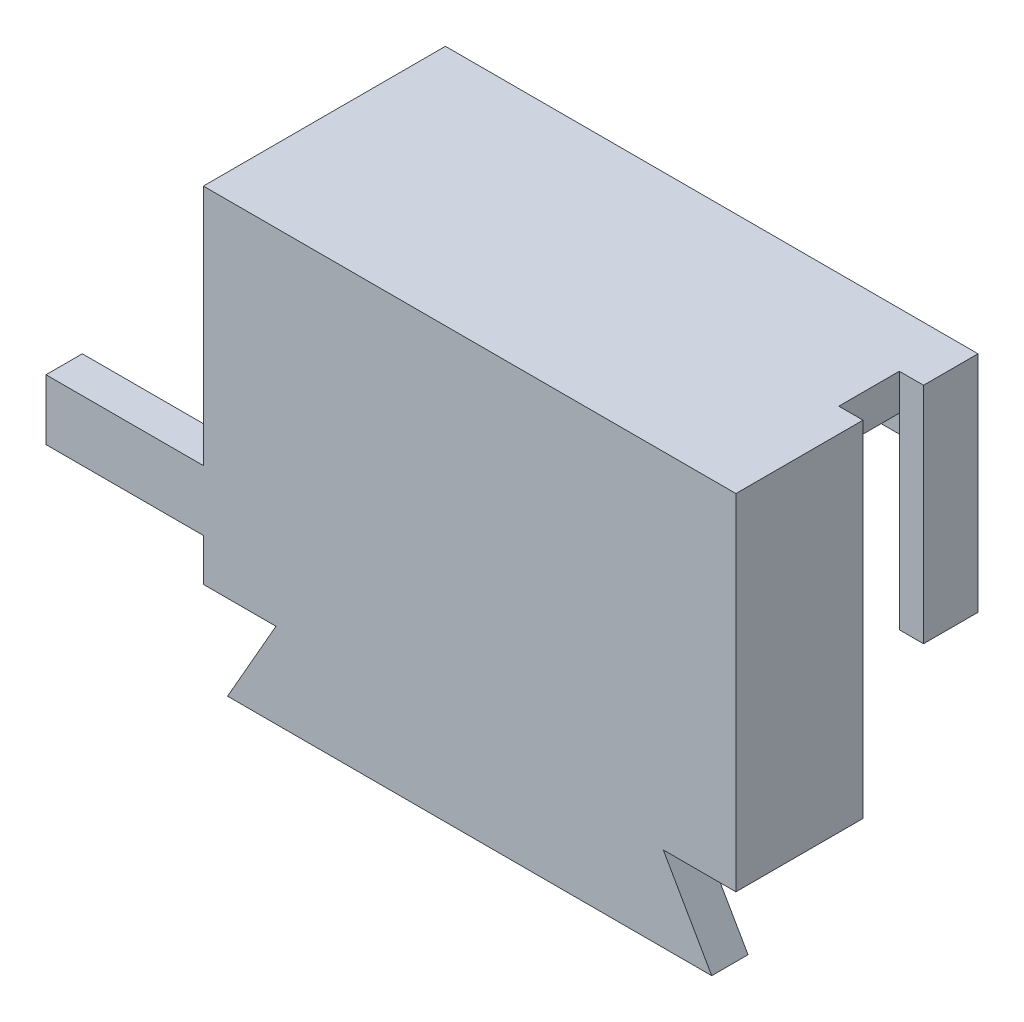
ISO-10303-21;
HEADER;
FILE_DESCRIPTION(('STEP AP214'),'2;1');
FILE_NAME('part.step','',(''),(''),'','','');
FILE_SCHEMA(('AUTOMOTIVE_DESIGN { 1 0 10303 214 1 1 1 1 }'));
ENDSEC;
DATA;
#1=APPLICATION_CONTEXT('core data for automotive mechanical design processes');
#2=APPLICATION_PROTOCOL_DEFINITION('international standard','automotive_design',2000,#1);
#3=PRODUCT_CONTEXT('',#1,'mechanical');
#4=PRODUCT('Part','Part','',(#3));
#5=PRODUCT_RELATED_PRODUCT_CATEGORY('part','',(#4));
#6=PRODUCT_DEFINITION_FORMATION('','',#4);
#7=PRODUCT_DEFINITION_CONTEXT('part definition',#1,'design');
#8=PRODUCT_DEFINITION('design','',#6,#7);
#9=PRODUCT_DEFINITION_SHAPE('','',#8);
#10=(LENGTH_UNIT() NAMED_UNIT(*) SI_UNIT(.MILLI.,.METRE.));
#11=(NAMED_UNIT(*) PLANE_ANGLE_UNIT() SI_UNIT($,.RADIAN.));
#12=(NAMED_UNIT(*) SI_UNIT($,.STERADIAN.) SOLID_ANGLE_UNIT());
#13=UNCERTAINTY_MEASURE_WITH_UNIT(LENGTH_MEASURE(1.E-05),#10,'distance_accuracy_value','');
#14=(GEOMETRIC_REPRESENTATION_CONTEXT(3) GLOBAL_UNCERTAINTY_ASSIGNED_CONTEXT((#13)) GLOBAL_UNIT_ASSIGNED_CONTEXT((#10,
#11,#12)) REPRESENTATION_CONTEXT('',''));
#15=CARTESIAN_POINT('',(0.,0.,0.));
#16=DIRECTION('',(0.,0.,1.));
#17=DIRECTION('',(1.,0.,0.));
#18=AXIS2_PLACEMENT_3D('',#15,#16,#17);
#19=CARTESIAN_POINT('',(-164.75,17.,3.));
#20=DIRECTION('',(0.,1.,0.));
#21=DIRECTION('',(0.,0.,1.));
#22=AXIS2_PLACEMENT_3D('',#19,#20,#21);
#23=PLANE('',#22);
#24=DIRECTION('',(0.,0.,1.));
#25=VECTOR('',#24,1.);
#26=CARTESIAN_POINT('',(-170.75,17.,3.00000000000001));
#27=LINE('',#26,#25);
#28=CARTESIAN_POINT('',(-170.75,17.,0.));
#29=VERTEX_POINT('',#28);
#30=CARTESIAN_POINT('',(-170.75,17.,3.00000000000001));
#31=VERTEX_POINT('',#30);
#32=EDGE_CURVE('E264',#29,#31,#27,.T.);
#33=ORIENTED_EDGE('',*,*,#32,.F.);
#34=DIRECTION('',(1.,0.,0.));
#35=VECTOR('',#34,1.);
#36=CARTESIAN_POINT('',(-164.75,17.,0.));
#37=LINE('',#36,#35);
#38=CARTESIAN_POINT('',(-164.75,17.,0.));
#39=VERTEX_POINT('',#38);
#40=EDGE_CURVE('E379',#29,#39,#37,.T.);
#41=ORIENTED_EDGE('',*,*,#40,.T.);
#42=DIRECTION('',(0.,0.,-1.));
#43=VECTOR('',#42,1.);
#44=CARTESIAN_POINT('',(-164.75,17.,3.));
#45=LINE('',#44,#43);
#46=CARTESIAN_POINT('',(-164.75,17.,3.));
#47=VERTEX_POINT('',#46);
#48=EDGE_CURVE('E384',#47,#39,#45,.T.);
#49=ORIENTED_EDGE('',*,*,#48,.F.);
#50=DIRECTION('',(1.,0.,0.));
#51=VECTOR('',#50,1.);
#52=CARTESIAN_POINT('',(-164.75,17.,3.));
#53=LINE('',#52,#51);
#54=EDGE_CURVE('E354',#31,#47,#53,.T.);
#55=ORIENTED_EDGE('',*,*,#54,.F.);
#56=EDGE_LOOP('',(#33,#41,#49,#55));
#57=FACE_BOUND('',#56,.T.);
#58=ADVANCED_FACE('F35',(#57),#23,.F.);
#59=CARTESIAN_POINT('',(-170.75,0.,0.));
#60=DIRECTION('',(1.,0.,0.));
#61=DIRECTION('',(0.,0.,-1.));
#62=AXIS2_PLACEMENT_3D('',#59,#60,#61);
#63=PLANE('',#62);
#64=DIRECTION('',(0.,0.,-1.));
#65=VECTOR('',#64,1.);
#66=CARTESIAN_POINT('',(-170.75,20.5,3.));
#67=LINE('',#66,#65);
#68=CARTESIAN_POINT('',(-170.75,20.5,3.00000000000001));
#69=VERTEX_POINT('',#68);
#70=CARTESIAN_POINT('',(-170.75,20.5,0.));
#71=VERTEX_POINT('',#70);
#72=EDGE_CURVE('E274',#69,#71,#67,.T.);
#73=ORIENTED_EDGE('',*,*,#72,.T.);
#74=DIRECTION('',(0.,1.,0.));
#75=VECTOR('',#74,1.);
#76=CARTESIAN_POINT('',(-170.75,17.,0.));
#77=LINE('',#76,#75);
#78=EDGE_CURVE('E227',#29,#71,#77,.T.);
#79=ORIENTED_EDGE('',*,*,#78,.F.);
#80=ORIENTED_EDGE('',*,*,#32,.T.);
#81=DIRECTION('',(0.,1.,0.));
#82=VECTOR('',#81,1.);
#83=CARTESIAN_POINT('',(-170.75,45.5,3.));
#84=LINE('',#83,#82);
#85=EDGE_CURVE('E256',#31,#69,#84,.T.);
#86=ORIENTED_EDGE('',*,*,#85,.T.);
#87=EDGE_LOOP('',(#73,#79,#80,#86));
#88=FACE_BOUND('',#87,.T.);
#89=ADVANCED_FACE('F437',(#88),#63,.F.);
#90=CARTESIAN_POINT('',(0.,42.5,0.));
#91=DIRECTION('',(0.,1.,0.));
#92=DIRECTION('',(0.,0.,1.));
#93=AXIS2_PLACEMENT_3D('',#90,#91,#92);
#94=PLANE('',#93);
#95=DIRECTION('',(-1.,0.,0.));
#96=VECTOR('',#95,1.);
#97=CARTESIAN_POINT('',(-168.75,42.5,-14.));
#98=LINE('',#97,#96);
#99=CARTESIAN_POINT('',(-128.75,42.5,-14.));
#100=VERTEX_POINT('',#99);
#101=CARTESIAN_POINT('',(-168.75,42.5,-14.));
#102=VERTEX_POINT('',#101);
#103=EDGE_CURVE('E238',#100,#102,#98,.T.);
#104=ORIENTED_EDGE('',*,*,#103,.F.);
#105=DIRECTION('',(0.,0.,1.));
#106=VECTOR('',#105,1.);
#107=CARTESIAN_POINT('',(-128.75,42.5,0.));
#108=LINE('',#107,#106);
#109=CARTESIAN_POINT('',(-128.75,42.5,-12.5));
#110=VERTEX_POINT('',#109);
#111=EDGE_CURVE('E305',#100,#110,#108,.T.);
#112=ORIENTED_EDGE('',*,*,#111,.T.);
#113=DIRECTION('',(0.,0.,-1.));
#114=VECTOR('',#113,1.);
#115=CARTESIAN_POINT('',(-128.75,42.5,3.));
#116=LINE('',#115,#114);
#117=CARTESIAN_POINT('',(-128.75,42.5,-7.5));
#118=VERTEX_POINT('',#117);
#119=EDGE_CURVE('E327',#118,#110,#116,.T.);
#120=ORIENTED_EDGE('',*,*,#119,.F.);
#121=CARTESIAN_POINT('',(-128.75,42.5,0.));
#122=VERTEX_POINT('',#121);
#123=EDGE_CURVE('E336',#122,#118,#116,.T.);
#124=ORIENTED_EDGE('',*,*,#123,.F.);
#125=DIRECTION('',(-1.,0.,0.));
#126=VECTOR('',#125,1.);
#127=CARTESIAN_POINT('',(-168.75,42.5,0.));
#128=LINE('',#127,#126);
#129=CARTESIAN_POINT('',(-168.75,42.5,0.));
#130=VERTEX_POINT('',#129);
#131=EDGE_CURVE('E368',#122,#130,#128,.T.);
#132=ORIENTED_EDGE('',*,*,#131,.T.);
#133=DIRECTION('',(0.,0.,1.));
#134=VECTOR('',#133,1.);
#135=CARTESIAN_POINT('',(-168.75,42.5,3.));
#136=LINE('',#135,#134);
#137=EDGE_CURVE('E331',#102,#130,#136,.T.);
#138=ORIENTED_EDGE('',*,*,#137,.F.);
#139=EDGE_LOOP('',(#104,#112,#120,#124,#132,#138));
#140=FACE_BOUND('',#139,.T.);
#141=ADVANCED_FACE('F479',(#140),#94,.F.);
#142=CARTESIAN_POINT('',(-128.75,-1.93163803270931E-13,0.));
#143=DIRECTION('',(-1.,0.,0.));
#144=DIRECTION('',(0.,-1.,0.));
#145=AXIS2_PLACEMENT_3D('',#142,#143,#144);
#146=PLANE('',#145);
#147=ORIENTED_EDGE('',*,*,#111,.F.);
#148=DIRECTION('',(0.,1.,0.));
#149=VECTOR('',#148,1.);
#150=CARTESIAN_POINT('',(-128.75,39.5,-14.));
#151=LINE('',#150,#149);
#152=CARTESIAN_POINT('',(-128.75,39.5,-14.));
#153=VERTEX_POINT('',#152);
#154=EDGE_CURVE('E253',#153,#100,#151,.T.);
#155=ORIENTED_EDGE('',*,*,#154,.F.);
#156=DIRECTION('',(0.,0.,1.));
#157=VECTOR('',#156,1.);
#158=CARTESIAN_POINT('',(-128.75,39.5,-17.));
#159=LINE('',#158,#157);
#160=CARTESIAN_POINT('',(-128.75,39.5,-17.));
#161=VERTEX_POINT('',#160);
#162=EDGE_CURVE('E247',#161,#153,#159,.T.);
#163=ORIENTED_EDGE('',*,*,#162,.F.);
#164=DIRECTION('',(0.,1.,0.));
#165=VECTOR('',#164,1.);
#166=CARTESIAN_POINT('',(-128.75,45.5,-17.));
#167=LINE('',#166,#165);
#168=CARTESIAN_POINT('',(-128.75,27.,-17.));
#169=VERTEX_POINT('',#168);
#170=EDGE_CURVE('E279',#169,#161,#167,.T.);
#171=ORIENTED_EDGE('',*,*,#170,.F.);
#172=DIRECTION('',(0.,0.,-1.));
#173=VECTOR('',#172,1.);
#174=CARTESIAN_POINT('',(-128.75,27.,-17.));
#175=LINE('',#174,#173);
#176=CARTESIAN_POINT('',(-128.75,27.,-12.5));
#177=VERTEX_POINT('',#176);
#178=EDGE_CURVE('E284',#177,#169,#175,.T.);
#179=ORIENTED_EDGE('',*,*,#178,.F.);
#180=DIRECTION('',(0.,-1.,0.));
#181=VECTOR('',#180,1.);
#182=CARTESIAN_POINT('',(-128.75,45.5,-12.5));
#183=LINE('',#182,#181);
#184=EDGE_CURVE('E293',#110,#177,#183,.T.);
#185=ORIENTED_EDGE('',*,*,#184,.F.);
#186=EDGE_LOOP('',(#147,#155,#163,#171,#179,#185));
#187=FACE_BOUND('',#186,.T.);
#188=ADVANCED_FACE('F474',(#187),#146,.T.);
#189=CARTESIAN_POINT('',(-168.75,0.,0.));
#190=DIRECTION('',(1.,0.,0.));
#191=DIRECTION('',(0.,0.,-1.));
#192=AXIS2_PLACEMENT_3D('',#189,#190,#191);
#193=PLANE('',#192);
#194=DIRECTION('',(0.,-1.,0.));
#195=VECTOR('',#194,1.);
#196=CARTESIAN_POINT('',(-168.75,17.,-3.2));
#197=LINE('',#196,#195);
#198=CARTESIAN_POINT('',(-168.75,25.5,-3.2));
#199=VERTEX_POINT('',#198);
#200=CARTESIAN_POINT('',(-168.75,17.,-3.2));
#201=VERTEX_POINT('',#200);
#202=EDGE_CURVE('E207',#199,#201,#197,.T.);
#203=ORIENTED_EDGE('',*,*,#202,.T.);
#204=DIRECTION('',(0.,0.,1.));
#205=VECTOR('',#204,1.);
#206=CARTESIAN_POINT('',(-168.75,17.,3.00000000000001));
#207=LINE('',#206,#205);
#208=CARTESIAN_POINT('',(-168.75,17.,-17.));
#209=VERTEX_POINT('',#208);
#210=EDGE_CURVE('E270',#209,#201,#207,.T.);
#211=ORIENTED_EDGE('',*,*,#210,.F.);
#212=DIRECTION('',(0.,-1.,0.));
#213=VECTOR('',#212,1.);
#214=CARTESIAN_POINT('',(-168.75,45.5,-17.));
#215=LINE('',#214,#213);
#216=CARTESIAN_POINT('',(-168.75,39.5,-17.));
#217=VERTEX_POINT('',#216);
#218=EDGE_CURVE('E255',#217,#209,#215,.T.);
#219=ORIENTED_EDGE('',*,*,#218,.F.);
#220=DIRECTION('',(0.,0.,-1.));
#221=VECTOR('',#220,1.);
#222=CARTESIAN_POINT('',(-168.75,39.5,-17.));
#223=LINE('',#222,#221);
#224=CARTESIAN_POINT('',(-168.75,39.5,-14.));
#225=VERTEX_POINT('',#224);
#226=EDGE_CURVE('E242',#225,#217,#223,.T.);
#227=ORIENTED_EDGE('',*,*,#226,.F.);
#228=DIRECTION('',(0.,1.,0.));
#229=VECTOR('',#228,1.);
#230=CARTESIAN_POINT('',(-168.75,39.5,-14.));
#231=LINE('',#230,#229);
#232=EDGE_CURVE('E50',#225,#102,#231,.T.);
#233=ORIENTED_EDGE('',*,*,#232,.T.);
#234=ORIENTED_EDGE('',*,*,#137,.T.);
#235=DIRECTION('',(0.,-1.,0.));
#236=VECTOR('',#235,1.);
#237=CARTESIAN_POINT('',(-168.75,17.,0.));
#238=LINE('',#237,#236);
#239=CARTESIAN_POINT('',(-168.75,25.5,0.));
#240=VERTEX_POINT('',#239);
#241=EDGE_CURVE('E232',#130,#240,#238,.T.);
#242=ORIENTED_EDGE('',*,*,#241,.T.);
#243=DIRECTION('',(0.,0.,-1.));
#244=VECTOR('',#243,1.);
#245=CARTESIAN_POINT('',(-168.75,25.5,0.));
#246=LINE('',#245,#244);
#247=EDGE_CURVE('E222',#240,#199,#246,.T.);
#248=ORIENTED_EDGE('',*,*,#247,.T.);
#249=EDGE_LOOP('',(#203,#211,#219,#227,#233,#234,#242,#248));
#250=FACE_BOUND('',#249,.T.);
#251=ADVANCED_FACE('F230',(#250),#193,.T.);
#252=CARTESIAN_POINT('',(-183.75,25.5,3.));
#253=DIRECTION('',(0.,-1.,0.));
#254=DIRECTION('',(1.,0.,0.));
#255=AXIS2_PLACEMENT_3D('',#252,#253,#254);
#256=PLANE('',#255);
#257=DIRECTION('',(0.,0.,1.));
#258=VECTOR('',#257,1.);
#259=CARTESIAN_POINT('',(-170.75,25.5,3.));
#260=LINE('',#259,#258);
#261=CARTESIAN_POINT('',(-170.75,25.5,0.));
#262=VERTEX_POINT('',#261);
#263=CARTESIAN_POINT('',(-170.75,25.5,3.00000000000001));
#264=VERTEX_POINT('',#263);
#265=EDGE_CURVE('E277',#262,#264,#260,.T.);
#266=ORIENTED_EDGE('',*,*,#265,.F.);
#267=DIRECTION('',(-1.,0.,0.));
#268=VECTOR('',#267,1.);
#269=CARTESIAN_POINT('',(-183.75,25.5,0.));
#270=LINE('',#269,#268);
#271=CARTESIAN_POINT('',(-183.75,25.5,0.));
#272=VERTEX_POINT('',#271);
#273=EDGE_CURVE('E371',#262,#272,#270,.T.);
#274=ORIENTED_EDGE('',*,*,#273,.T.);
#275=DIRECTION('',(0.,0.,-1.));
#276=VECTOR('',#275,1.);
#277=CARTESIAN_POINT('',(-183.75,25.5,3.));
#278=LINE('',#277,#276);
#279=CARTESIAN_POINT('',(-183.75,25.5,3.));
#280=VERTEX_POINT('',#279);
#281=EDGE_CURVE('E390',#280,#272,#278,.T.);
#282=ORIENTED_EDGE('',*,*,#281,.F.);
#283=DIRECTION('',(-1.,0.,0.));
#284=VECTOR('',#283,1.);
#285=CARTESIAN_POINT('',(-183.75,25.5,3.));
#286=LINE('',#285,#284);
#287=EDGE_CURVE('E347',#264,#280,#286,.T.);
#288=ORIENTED_EDGE('',*,*,#287,.F.);
#289=EDGE_LOOP('',(#266,#274,#282,#288));
#290=FACE_BOUND('',#289,.T.);
#291=ADVANCED_FACE('F453',(#290),#256,.F.);
#292=CARTESIAN_POINT('',(-168.75,20.5,3.));
#293=DIRECTION('',(0.,1.,0.));
#294=DIRECTION('',(-1.,0.,0.));
#295=AXIS2_PLACEMENT_3D('',#292,#293,#294);
#296=PLANE('',#295);
#297=ORIENTED_EDGE('',*,*,#72,.F.);
#298=DIRECTION('',(1.,0.,0.));
#299=VECTOR('',#298,1.);
#300=CARTESIAN_POINT('',(-168.75,20.5,3.));
#301=LINE('',#300,#299);
#302=CARTESIAN_POINT('',(-183.75,20.5,3.));
#303=VERTEX_POINT('',#302);
#304=EDGE_CURVE('E351',#303,#69,#301,.T.);
#305=ORIENTED_EDGE('',*,*,#304,.F.);
#306=DIRECTION('',(0.,0.,-1.));
#307=VECTOR('',#306,1.);
#308=CARTESIAN_POINT('',(-183.75,20.5,3.));
#309=LINE('',#308,#307);
#310=CARTESIAN_POINT('',(-183.75,20.5,0.));
#311=VERTEX_POINT('',#310);
#312=EDGE_CURVE('E387',#303,#311,#309,.T.);
#313=ORIENTED_EDGE('',*,*,#312,.T.);
#314=DIRECTION('',(1.,0.,0.));
#315=VECTOR('',#314,1.);
#316=CARTESIAN_POINT('',(-168.75,20.5,0.));
#317=LINE('',#316,#315);
#318=EDGE_CURVE('E375',#311,#71,#317,.T.);
#319=ORIENTED_EDGE('',*,*,#318,.T.);
#320=EDGE_LOOP('',(#297,#305,#313,#319));
#321=FACE_BOUND('',#320,.T.);
#322=ADVANCED_FACE('F443',(#321),#296,.F.);
#323=CARTESIAN_POINT('',(-128.75,42.5,3.));
#324=DIRECTION('',(-1.,0.,0.));
#325=DIRECTION('',(0.,-1.,0.));
#326=AXIS2_PLACEMENT_3D('',#323,#324,#325);
#327=PLANE('',#326);
#328=CARTESIAN_POINT('',(-128.75,45.5,-12.5));
#329=VERTEX_POINT('',#328);
#330=EDGE_CURVE('E294',#329,#110,#183,.T.);
#331=ORIENTED_EDGE('',*,*,#330,.F.);
#332=DIRECTION('',(0.,0.,-1.));
#333=VECTOR('',#332,1.);
#334=CARTESIAN_POINT('',(-128.75,45.5,3.));
#335=LINE('',#334,#333);
#336=CARTESIAN_POINT('',(-128.75,45.5,-7.5));
#337=VERTEX_POINT('',#336);
#338=EDGE_CURVE('E328',#337,#329,#335,.T.);
#339=ORIENTED_EDGE('',*,*,#338,.F.);
#340=DIRECTION('',(0.,1.,0.));
#341=VECTOR('',#340,1.);
#342=CARTESIAN_POINT('',(-128.75,45.5,-7.5));
#343=LINE('',#342,#341);
#344=EDGE_CURVE('E320',#118,#337,#343,.T.);
#345=ORIENTED_EDGE('',*,*,#344,.F.);
#346=ORIENTED_EDGE('',*,*,#119,.T.);
#347=EDGE_LOOP('',(#331,#339,#345,#346));
#348=FACE_BOUND('',#347,.T.);
#349=ADVANCED_FACE('F484',(#348),#327,.F.);
#350=CARTESIAN_POINT('',(-128.75,9.99999999999999,3.));
#351=DIRECTION('',(0.,1.,0.));
#352=DIRECTION('',(-1.,0.,0.));
#353=AXIS2_PLACEMENT_3D('',#350,#351,#352);
#354=PLANE('',#353);
#355=DIRECTION('',(1.,0.,0.));
#356=VECTOR('',#355,1.);
#357=CARTESIAN_POINT('',(-128.75,9.99999999999999,0.));
#358=LINE('',#357,#356);
#359=CARTESIAN_POINT('',(-168.75,10.,0.));
#360=VERTEX_POINT('',#359);
#361=CARTESIAN_POINT('',(-128.75,9.99999999999999,0.));
#362=VERTEX_POINT('',#361);
#363=EDGE_CURVE('E335',#360,#362,#358,.T.);
#364=ORIENTED_EDGE('',*,*,#363,.T.);
#365=DIRECTION('',(0.,0.,-1.));
#366=VECTOR('',#365,1.);
#367=CARTESIAN_POINT('',(-128.75,9.99999999999999,3.));
#368=LINE('',#367,#366);
#369=CARTESIAN_POINT('',(-128.75,9.99999999999999,3.));
#370=VERTEX_POINT('',#369);
#371=EDGE_CURVE('E11',#370,#362,#368,.T.);
#372=ORIENTED_EDGE('',*,*,#371,.F.);
#373=DIRECTION('',(1.,0.,0.));
#374=VECTOR('',#373,1.);
#375=CARTESIAN_POINT('',(-128.75,9.99999999999999,3.));
#376=LINE('',#375,#374);
#377=CARTESIAN_POINT('',(-168.75,10.,3.));
#378=VERTEX_POINT('',#377);
#379=EDGE_CURVE('E339',#378,#370,#376,.T.);
#380=ORIENTED_EDGE('',*,*,#379,.F.);
#381=DIRECTION('',(0.,0.,-1.));
#382=VECTOR('',#381,1.);
#383=CARTESIAN_POINT('',(-168.75,10.,3.));
#384=LINE('',#383,#382);
#385=EDGE_CURVE('E358',#378,#360,#384,.T.);
#386=ORIENTED_EDGE('',*,*,#385,.T.);
#387=EDGE_LOOP('',(#364,#372,#380,#386));
#388=FACE_BOUND('',#387,.T.);
#389=ADVANCED_FACE('F37',(#388),#354,.F.);
#390=CARTESIAN_POINT('',(-132.75,17.,3.));
#391=DIRECTION('',(-0.868243142124461,-0.496138938356831,0.));
#392=DIRECTION('',(0.496138938356831,-0.868243142124461,0.));
#393=AXIS2_PLACEMENT_3D('',#390,#391,#392);
#394=PLANE('',#393);
#395=DIRECTION('',(-0.496138938356831,0.868243142124461,0.));
#396=VECTOR('',#395,1.);
#397=CARTESIAN_POINT('',(-132.75,17.,0.));
#398=LINE('',#397,#396);
#399=CARTESIAN_POINT('',(-132.75,17.,0.));
#400=VERTEX_POINT('',#399);
#401=EDGE_CURVE('E361',#362,#400,#398,.T.);
#402=ORIENTED_EDGE('',*,*,#401,.T.);
#403=DIRECTION('',(0.,0.,-1.));
#404=VECTOR('',#403,1.);
#405=CARTESIAN_POINT('',(-132.75,17.,3.));
#406=LINE('',#405,#404);
#407=CARTESIAN_POINT('',(-132.75,17.,3.));
#408=VERTEX_POINT('',#407);
#409=EDGE_CURVE('E43',#408,#400,#406,.T.);
#410=ORIENTED_EDGE('',*,*,#409,.F.);
#411=DIRECTION('',(-0.496138938356831,0.868243142124461,0.));
#412=VECTOR('',#411,1.);
#413=CARTESIAN_POINT('',(-132.75,17.,3.));
#414=LINE('',#413,#412);
#415=EDGE_CURVE('E342',#370,#408,#414,.T.);
#416=ORIENTED_EDGE('',*,*,#415,.F.);
#417=ORIENTED_EDGE('',*,*,#371,.T.);
#418=EDGE_LOOP('',(#402,#410,#416,#417));
#419=FACE_BOUND('',#418,.T.);
#420=ADVANCED_FACE('F423',(#419),#394,.F.);
#421=CARTESIAN_POINT('',(-128.75,17.,3.));
#422=DIRECTION('',(0.,1.,0.));
#423=DIRECTION('',(0.,0.,1.));
#424=AXIS2_PLACEMENT_3D('',#421,#422,#423);
#425=PLANE('',#424);
#426=DIRECTION('',(1.,0.,0.));
#427=VECTOR('',#426,1.);
#428=CARTESIAN_POINT('',(-128.75,17.,0.));
#429=LINE('',#428,#427);
#430=CARTESIAN_POINT('',(-128.75,17.,0.));
#431=VERTEX_POINT('',#430);
#432=EDGE_CURVE('E363',#400,#431,#429,.T.);
#433=ORIENTED_EDGE('',*,*,#432,.T.);
#434=DIRECTION('',(0.,0.,-1.));
#435=VECTOR('',#434,1.);
#436=CARTESIAN_POINT('',(-128.75,17.,3.));
#437=LINE('',#436,#435);
#438=CARTESIAN_POINT('',(-128.75,17.,-7.5));
#439=VERTEX_POINT('',#438);
#440=EDGE_CURVE('E307',#431,#439,#437,.T.);
#441=ORIENTED_EDGE('',*,*,#440,.T.);
#442=DIRECTION('',(-1.,0.,0.));
#443=VECTOR('',#442,1.);
#444=CARTESIAN_POINT('',(-126.75,17.,-7.5));
#445=LINE('',#444,#443);
#446=CARTESIAN_POINT('',(-126.75,17.,-7.5));
#447=VERTEX_POINT('',#446);
#448=EDGE_CURVE('E324',#447,#439,#445,.T.);
#449=ORIENTED_EDGE('',*,*,#448,.F.);
#450=DIRECTION('',(0.,0.,-1.));
#451=VECTOR('',#450,1.);
#452=CARTESIAN_POINT('',(-126.75,17.,3.));
#453=LINE('',#452,#451);
#454=CARTESIAN_POINT('',(-126.75,17.,3.));
#455=VERTEX_POINT('',#454);
#456=EDGE_CURVE('E311',#455,#447,#453,.T.);
#457=ORIENTED_EDGE('',*,*,#456,.F.);
#458=DIRECTION('',(1.,0.,0.));
#459=VECTOR('',#458,1.);
#460=CARTESIAN_POINT('',(-128.75,17.,3.));
#461=LINE('',#460,#459);
#462=EDGE_CURVE('E345',#408,#455,#461,.T.);
#463=ORIENTED_EDGE('',*,*,#462,.F.);
#464=ORIENTED_EDGE('',*,*,#409,.T.);
#465=EDGE_LOOP('',(#433,#441,#449,#457,#463,#464));
#466=FACE_BOUND('',#465,.T.);
#467=ADVANCED_FACE('F397',(#466),#425,.F.);
#468=CARTESIAN_POINT('',(-183.75,20.5,3.));
#469=DIRECTION('',(1.,0.,0.));
#470=DIRECTION('',(0.,0.,-1.));
#471=AXIS2_PLACEMENT_3D('',#468,#469,#470);
#472=PLANE('',#471);
#473=DIRECTION('',(0.,-1.,0.));
#474=VECTOR('',#473,1.);
#475=CARTESIAN_POINT('',(-183.75,20.5,0.));
#476=LINE('',#475,#474);
#477=EDGE_CURVE('E373',#272,#311,#476,.T.);
#478=ORIENTED_EDGE('',*,*,#477,.T.);
#479=ORIENTED_EDGE('',*,*,#312,.F.);
#480=DIRECTION('',(0.,-1.,0.));
#481=VECTOR('',#480,1.);
#482=CARTESIAN_POINT('',(-183.75,20.5,3.));
#483=LINE('',#482,#481);
#484=EDGE_CURVE('E349',#280,#303,#483,.T.);
#485=ORIENTED_EDGE('',*,*,#484,.F.);
#486=ORIENTED_EDGE('',*,*,#281,.T.);
#487=EDGE_LOOP('',(#478,#479,#485,#486));
#488=FACE_BOUND('',#487,.T.);
#489=ADVANCED_FACE('F448',(#488),#472,.F.);
#490=ORIENTED_EDGE('',*,*,#210,.T.);
#491=DIRECTION('',(-1.,0.,0.));
#492=VECTOR('',#491,1.);
#493=CARTESIAN_POINT('',(-126.749,17.,-3.2));
#494=LINE('',#493,#492);
#495=CARTESIAN_POINT('',(-170.75,17.,-3.2));
#496=VERTEX_POINT('',#495);
#497=EDGE_CURVE('E213',#201,#496,#494,.T.);
#498=ORIENTED_EDGE('',*,*,#497,.T.);
#499=CARTESIAN_POINT('',(-170.75,17.,-17.));
#500=VERTEX_POINT('',#499);
#501=EDGE_CURVE('E265',#500,#496,#27,.T.);
#502=ORIENTED_EDGE('',*,*,#501,.F.);
#503=DIRECTION('',(1.,0.,0.));
#504=VECTOR('',#503,1.);
#505=CARTESIAN_POINT('',(-170.75,17.,-17.));
#506=LINE('',#505,#504);
#507=EDGE_CURVE('E268',#500,#209,#506,.T.);
#508=ORIENTED_EDGE('',*,*,#507,.T.);
#509=EDGE_LOOP('',(#490,#498,#502,#508));
#510=FACE_BOUND('',#509,.T.);
#511=ADVANCED_FACE('F458',(#510),#23,.F.);
#512=CARTESIAN_POINT('',(-168.75,10.,3.));
#513=DIRECTION('',(0.868243142124459,-0.496138938356834,0.));
#514=DIRECTION('',(0.496138938356834,0.868243142124459,0.));
#515=AXIS2_PLACEMENT_3D('',#512,#513,#514);
#516=PLANE('',#515);
#517=DIRECTION('',(-0.496138938356834,-0.868243142124459,0.));
#518=VECTOR('',#517,1.);
#519=CARTESIAN_POINT('',(-168.75,10.,0.));
#520=LINE('',#519,#518);
#521=EDGE_CURVE('E343',#39,#360,#520,.T.);
#522=ORIENTED_EDGE('',*,*,#521,.T.);
#523=ORIENTED_EDGE('',*,*,#385,.F.);
#524=DIRECTION('',(-0.496138938356834,-0.868243142124459,0.));
#525=VECTOR('',#524,1.);
#526=CARTESIAN_POINT('',(-168.75,10.,3.));
#527=LINE('',#526,#525);
#528=EDGE_CURVE('E356',#47,#378,#527,.T.);
#529=ORIENTED_EDGE('',*,*,#528,.F.);
#530=ORIENTED_EDGE('',*,*,#48,.T.);
#531=EDGE_LOOP('',(#522,#523,#529,#530));
#532=FACE_BOUND('',#531,.T.);
#533=ADVANCED_FACE('F429',(#532),#516,.F.);
#534=CARTESIAN_POINT('',(0.,0.,3.));
#535=DIRECTION('',(0.,0.,-1.));
#536=DIRECTION('',(-1.,0.,0.));
#537=AXIS2_PLACEMENT_3D('',#534,#535,#536);
#538=PLANE('',#537);
#539=CARTESIAN_POINT('',(-170.75,45.5,3.));
#540=VERTEX_POINT('',#539);
#541=EDGE_CURVE('E259',#264,#540,#84,.T.);
#542=ORIENTED_EDGE('',*,*,#541,.F.);
#543=ORIENTED_EDGE('',*,*,#287,.T.);
#544=ORIENTED_EDGE('',*,*,#484,.T.);
#545=ORIENTED_EDGE('',*,*,#304,.T.);
#546=ORIENTED_EDGE('',*,*,#85,.F.);
#547=ORIENTED_EDGE('',*,*,#54,.T.);
#548=ORIENTED_EDGE('',*,*,#528,.T.);
#549=ORIENTED_EDGE('',*,*,#379,.T.);
#550=ORIENTED_EDGE('',*,*,#415,.T.);
#551=ORIENTED_EDGE('',*,*,#462,.T.);
#552=DIRECTION('',(0.,-1.,0.));
#553=VECTOR('',#552,1.);
#554=CARTESIAN_POINT('',(-126.75,45.5,3.));
#555=LINE('',#554,#553);
#556=CARTESIAN_POINT('',(-126.75,45.5,3.));
#557=VERTEX_POINT('',#556);
#558=EDGE_CURVE('E308',#557,#455,#555,.T.);
#559=ORIENTED_EDGE('',*,*,#558,.F.);
#560=DIRECTION('',(1.,0.,0.));
#561=VECTOR('',#560,1.);
#562=CARTESIAN_POINT('',(-128.75,45.5,3.));
#563=LINE('',#562,#561);
#564=EDGE_CURVE('E333',#540,#557,#563,.T.);
#565=ORIENTED_EDGE('',*,*,#564,.F.);
#566=EDGE_LOOP('',(#542,#543,#544,#545,#546,#547,#548,#549,#550,#551,#559,#565));
#567=FACE_BOUND('',#566,.T.);
#568=ADVANCED_FACE('F419',(#567),#538,.F.);
#569=CARTESIAN_POINT('',(0.,0.,0.));
#570=DIRECTION('',(0.,0.,-1.));
#571=DIRECTION('',(-1.,0.,0.));
#572=AXIS2_PLACEMENT_3D('',#569,#570,#571);
#573=PLANE('',#572);
#574=ORIENTED_EDGE('',*,*,#241,.F.);
#575=ORIENTED_EDGE('',*,*,#131,.F.);
#576=DIRECTION('',(0.,1.,0.));
#577=VECTOR('',#576,1.);
#578=CARTESIAN_POINT('',(-128.75,42.5,0.));
#579=LINE('',#578,#577);
#580=EDGE_CURVE('E366',#431,#122,#579,.T.);
#581=ORIENTED_EDGE('',*,*,#580,.F.);
#582=ORIENTED_EDGE('',*,*,#432,.F.);
#583=ORIENTED_EDGE('',*,*,#401,.F.);
#584=ORIENTED_EDGE('',*,*,#363,.F.);
#585=ORIENTED_EDGE('',*,*,#521,.F.);
#586=ORIENTED_EDGE('',*,*,#40,.F.);
#587=ORIENTED_EDGE('',*,*,#78,.T.);
#588=ORIENTED_EDGE('',*,*,#318,.F.);
#589=ORIENTED_EDGE('',*,*,#477,.F.);
#590=ORIENTED_EDGE('',*,*,#273,.F.);
#591=DIRECTION('',(-1.,0.,0.));
#592=VECTOR('',#591,1.);
#593=CARTESIAN_POINT('',(-126.749,25.5,0.));
#594=LINE('',#593,#592);
#595=EDGE_CURVE('E218',#240,#262,#594,.T.);
#596=ORIENTED_EDGE('',*,*,#595,.F.);
#597=EDGE_LOOP('',(#574,#575,#581,#582,#583,#584,#585,#586,#587,#588,#589,#590,#596));
#598=FACE_BOUND('',#597,.T.);
#599=ADVANCED_FACE('F402',(#598),#573,.T.);
#600=CARTESIAN_POINT('',(-128.75,45.5,-17.));
#601=DIRECTION('',(0.,0.,1.));
#602=DIRECTION('',(1.,0.,0.));
#603=AXIS2_PLACEMENT_3D('',#600,#601,#602);
#604=PLANE('',#603);
#605=ORIENTED_EDGE('',*,*,#170,.T.);
#606=DIRECTION('',(1.,0.,0.));
#607=VECTOR('',#606,1.);
#608=CARTESIAN_POINT('',(-168.75,39.5,-17.));
#609=LINE('',#608,#607);
#610=EDGE_CURVE('E245',#217,#161,#609,.T.);
#611=ORIENTED_EDGE('',*,*,#610,.F.);
#612=ORIENTED_EDGE('',*,*,#218,.T.);
#613=ORIENTED_EDGE('',*,*,#507,.F.);
#614=DIRECTION('',(0.,-1.,0.));
#615=VECTOR('',#614,1.);
#616=CARTESIAN_POINT('',(-170.75,45.5,-17.));
#617=LINE('',#616,#615);
#618=CARTESIAN_POINT('',(-170.75,45.5,-17.));
#619=VERTEX_POINT('',#618);
#620=EDGE_CURVE('E262',#619,#500,#617,.T.);
#621=ORIENTED_EDGE('',*,*,#620,.F.);
#622=DIRECTION('',(-1.,0.,0.));
#623=VECTOR('',#622,1.);
#624=CARTESIAN_POINT('',(-128.75,45.5,-17.));
#625=LINE('',#624,#623);
#626=CARTESIAN_POINT('',(-126.75,45.5,-17.));
#627=VERTEX_POINT('',#626);
#628=EDGE_CURVE('E330',#627,#619,#625,.T.);
#629=ORIENTED_EDGE('',*,*,#628,.F.);
#630=DIRECTION('',(0.,1.,0.));
#631=VECTOR('',#630,1.);
#632=CARTESIAN_POINT('',(-126.75,45.5,-17.));
#633=LINE('',#632,#631);
#634=CARTESIAN_POINT('',(-126.75,27.,-17.));
#635=VERTEX_POINT('',#634);
#636=EDGE_CURVE('E280',#635,#627,#633,.T.);
#637=ORIENTED_EDGE('',*,*,#636,.F.);
#638=DIRECTION('',(-1.,0.,0.));
#639=VECTOR('',#638,1.);
#640=CARTESIAN_POINT('',(-126.75,27.,-17.));
#641=LINE('',#640,#639);
#642=EDGE_CURVE('E290',#635,#169,#641,.T.);
#643=ORIENTED_EDGE('',*,*,#642,.T.);
#644=EDGE_LOOP('',(#605,#611,#612,#613,#621,#629,#637,#643));
#645=FACE_BOUND('',#644,.T.);
#646=ADVANCED_FACE('F463',(#645),#604,.F.);
#647=CARTESIAN_POINT('',(0.,45.5,0.));
#648=DIRECTION('',(0.,1.,0.));
#649=DIRECTION('',(0.,0.,1.));
#650=AXIS2_PLACEMENT_3D('',#647,#648,#649);
#651=PLANE('',#650);
#652=ORIENTED_EDGE('',*,*,#564,.T.);
#653=DIRECTION('',(0.,0.,1.));
#654=VECTOR('',#653,1.);
#655=CARTESIAN_POINT('',(-126.75,45.5,3.));
#656=LINE('',#655,#654);
#657=CARTESIAN_POINT('',(-126.75,45.5,-7.5));
#658=VERTEX_POINT('',#657);
#659=EDGE_CURVE('E316',#658,#557,#656,.T.);
#660=ORIENTED_EDGE('',*,*,#659,.F.);
#661=DIRECTION('',(-1.,0.,0.));
#662=VECTOR('',#661,1.);
#663=CARTESIAN_POINT('',(-126.75,45.5,-7.5));
#664=LINE('',#663,#662);
#665=EDGE_CURVE('E58',#658,#337,#664,.T.);
#666=ORIENTED_EDGE('',*,*,#665,.T.);
#667=ORIENTED_EDGE('',*,*,#338,.T.);
#668=DIRECTION('',(-1.,0.,0.));
#669=VECTOR('',#668,1.);
#670=CARTESIAN_POINT('',(-126.75,45.5,-12.5));
#671=LINE('',#670,#669);
#672=CARTESIAN_POINT('',(-126.75,45.5,-12.5));
#673=VERTEX_POINT('',#672);
#674=EDGE_CURVE('E303',#673,#329,#671,.T.);
#675=ORIENTED_EDGE('',*,*,#674,.F.);
#676=DIRECTION('',(0.,0.,1.));
#677=VECTOR('',#676,1.);
#678=CARTESIAN_POINT('',(-126.75,45.5,-17.));
#679=LINE('',#678,#677);
#680=EDGE_CURVE('E283',#627,#673,#679,.T.);
#681=ORIENTED_EDGE('',*,*,#680,.F.);
#682=ORIENTED_EDGE('',*,*,#628,.T.);
#683=DIRECTION('',(0.,0.,-1.));
#684=VECTOR('',#683,1.);
#685=CARTESIAN_POINT('',(-170.75,45.5,3.));
#686=LINE('',#685,#684);
#687=EDGE_CURVE('E258',#540,#619,#686,.T.);
#688=ORIENTED_EDGE('',*,*,#687,.F.);
#689=EDGE_LOOP('',(#652,#660,#666,#667,#675,#681,#682,#688));
#690=FACE_BOUND('',#689,.T.);
#691=ADVANCED_FACE('F487',(#690),#651,.T.);
#692=CARTESIAN_POINT('',(-126.75,45.5,-7.5));
#693=DIRECTION('',(0.,0.,1.));
#694=DIRECTION('',(0.,-1.,0.));
#695=AXIS2_PLACEMENT_3D('',#692,#693,#694);
#696=PLANE('',#695);
#697=EDGE_CURVE('E312',#439,#118,#343,.T.);
#698=ORIENTED_EDGE('',*,*,#697,.T.);
#699=ORIENTED_EDGE('',*,*,#344,.T.);
#700=ORIENTED_EDGE('',*,*,#665,.F.);
#701=DIRECTION('',(0.,1.,0.));
#702=VECTOR('',#701,1.);
#703=CARTESIAN_POINT('',(-126.75,45.5,-7.5));
#704=LINE('',#703,#702);
#705=EDGE_CURVE('E314',#447,#658,#704,.T.);
#706=ORIENTED_EDGE('',*,*,#705,.F.);
#707=ORIENTED_EDGE('',*,*,#448,.T.);
#708=EDGE_LOOP('',(#698,#699,#700,#706,#707));
#709=FACE_BOUND('',#708,.T.);
#710=ADVANCED_FACE('F412',(#709),#696,.F.);
#711=CARTESIAN_POINT('',(-126.75,-1.23210122301989E-13,0.));
#712=DIRECTION('',(1.,0.,0.));
#713=DIRECTION('',(0.,1.,0.));
#714=AXIS2_PLACEMENT_3D('',#711,#712,#713);
#715=PLANE('',#714);
#716=ORIENTED_EDGE('',*,*,#558,.T.);
#717=ORIENTED_EDGE('',*,*,#456,.T.);
#718=ORIENTED_EDGE('',*,*,#705,.T.);
#719=ORIENTED_EDGE('',*,*,#659,.T.);
#720=EDGE_LOOP('',(#716,#717,#718,#719));
#721=FACE_BOUND('',#720,.T.);
#722=ADVANCED_FACE('F415',(#721),#715,.T.);
#723=CARTESIAN_POINT('',(-128.75,-1.25387030193411E-13,0.));
#724=DIRECTION('',(1.,0.,0.));
#725=DIRECTION('',(0.,1.,0.));
#726=AXIS2_PLACEMENT_3D('',#723,#724,#725);
#727=PLANE('',#726);
#728=ORIENTED_EDGE('',*,*,#580,.T.);
#729=ORIENTED_EDGE('',*,*,#123,.T.);
#730=ORIENTED_EDGE('',*,*,#697,.F.);
#731=ORIENTED_EDGE('',*,*,#440,.F.);
#732=EDGE_LOOP('',(#728,#729,#730,#731));
#733=FACE_BOUND('',#732,.T.);
#734=ADVANCED_FACE('F407',(#733),#727,.F.);
#735=CARTESIAN_POINT('',(-126.75,45.5,-12.5));
#736=DIRECTION('',(0.,0.,-1.));
#737=DIRECTION('',(0.,1.,0.));
#738=AXIS2_PLACEMENT_3D('',#735,#736,#737);
#739=PLANE('',#738);
#740=ORIENTED_EDGE('',*,*,#330,.T.);
#741=ORIENTED_EDGE('',*,*,#184,.T.);
#742=DIRECTION('',(-1.,0.,0.));
#743=VECTOR('',#742,1.);
#744=CARTESIAN_POINT('',(-126.75,27.,-12.5));
#745=LINE('',#744,#743);
#746=CARTESIAN_POINT('',(-126.75,27.,-12.5));
#747=VERTEX_POINT('',#746);
#748=EDGE_CURVE('E300',#747,#177,#745,.T.);
#749=ORIENTED_EDGE('',*,*,#748,.F.);
#750=DIRECTION('',(0.,-1.,0.));
#751=VECTOR('',#750,1.);
#752=CARTESIAN_POINT('',(-126.75,45.5,-12.5));
#753=LINE('',#752,#751);
#754=EDGE_CURVE('E286',#673,#747,#753,.T.);
#755=ORIENTED_EDGE('',*,*,#754,.F.);
#756=ORIENTED_EDGE('',*,*,#674,.T.);
#757=EDGE_LOOP('',(#740,#741,#749,#755,#756));
#758=FACE_BOUND('',#757,.T.);
#759=ADVANCED_FACE('F492',(#758),#739,.F.);
#760=CARTESIAN_POINT('',(-126.75,27.,-17.));
#761=DIRECTION('',(0.,1.,0.));
#762=DIRECTION('',(-1.,0.,0.));
#763=AXIS2_PLACEMENT_3D('',#760,#761,#762);
#764=PLANE('',#763);
#765=ORIENTED_EDGE('',*,*,#178,.T.);
#766=ORIENTED_EDGE('',*,*,#642,.F.);
#767=DIRECTION('',(0.,0.,-1.));
#768=VECTOR('',#767,1.);
#769=CARTESIAN_POINT('',(-126.75,27.,-17.));
#770=LINE('',#769,#768);
#771=EDGE_CURVE('E288',#747,#635,#770,.T.);
#772=ORIENTED_EDGE('',*,*,#771,.F.);
#773=ORIENTED_EDGE('',*,*,#748,.T.);
#774=EDGE_LOOP('',(#765,#766,#772,#773));
#775=FACE_BOUND('',#774,.T.);
#776=ADVANCED_FACE('F500',(#775),#764,.F.);
#777=CARTESIAN_POINT('',(-126.75,-1.90986895379509E-13,0.));
#778=DIRECTION('',(-1.,0.,0.));
#779=DIRECTION('',(0.,-1.,0.));
#780=AXIS2_PLACEMENT_3D('',#777,#778,#779);
#781=PLANE('',#780);
#782=ORIENTED_EDGE('',*,*,#636,.T.);
#783=ORIENTED_EDGE('',*,*,#680,.T.);
#784=ORIENTED_EDGE('',*,*,#754,.T.);
#785=ORIENTED_EDGE('',*,*,#771,.T.);
#786=EDGE_LOOP('',(#782,#783,#784,#785));
#787=FACE_BOUND('',#786,.T.);
#788=ADVANCED_FACE('F495',(#787),#781,.F.);
#789=ORIENTED_EDGE('',*,*,#501,.T.);
#790=DIRECTION('',(0.,-1.,0.));
#791=VECTOR('',#790,1.);
#792=CARTESIAN_POINT('',(-170.75,17.,-3.2));
#793=LINE('',#792,#791);
#794=CARTESIAN_POINT('',(-170.75,25.5,-3.2));
#795=VERTEX_POINT('',#794);
#796=EDGE_CURVE('E236',#795,#496,#793,.T.);
#797=ORIENTED_EDGE('',*,*,#796,.F.);
#798=DIRECTION('',(0.,0.,-1.));
#799=VECTOR('',#798,1.);
#800=CARTESIAN_POINT('',(-170.75,25.5,0.));
#801=LINE('',#800,#799);
#802=EDGE_CURVE('E225',#262,#795,#801,.T.);
#803=ORIENTED_EDGE('',*,*,#802,.F.);
#804=ORIENTED_EDGE('',*,*,#265,.T.);
#805=ORIENTED_EDGE('',*,*,#541,.T.);
#806=ORIENTED_EDGE('',*,*,#687,.T.);
#807=ORIENTED_EDGE('',*,*,#620,.T.);
#808=EDGE_LOOP('',(#789,#797,#803,#804,#805,#806,#807));
#809=FACE_BOUND('',#808,.T.);
#810=ADVANCED_FACE('F455',(#809),#63,.F.);
#811=CARTESIAN_POINT('',(-168.75,39.5,-14.));
#812=DIRECTION('',(0.,0.,-1.));
#813=DIRECTION('',(-1.,0.,0.));
#814=AXIS2_PLACEMENT_3D('',#811,#812,#813);
#815=PLANE('',#814);
#816=ORIENTED_EDGE('',*,*,#103,.T.);
#817=ORIENTED_EDGE('',*,*,#232,.F.);
#818=DIRECTION('',(-1.,0.,0.));
#819=VECTOR('',#818,1.);
#820=CARTESIAN_POINT('',(-168.75,39.5,-14.));
#821=LINE('',#820,#819);
#822=EDGE_CURVE('E249',#153,#225,#821,.T.);
#823=ORIENTED_EDGE('',*,*,#822,.F.);
#824=ORIENTED_EDGE('',*,*,#154,.T.);
#825=EDGE_LOOP('',(#816,#817,#823,#824));
#826=FACE_BOUND('',#825,.T.);
#827=ADVANCED_FACE('F470',(#826),#815,.F.);
#828=CARTESIAN_POINT('',(0.,39.5,0.));
#829=DIRECTION('',(0.,1.,0.));
#830=DIRECTION('',(0.,0.,1.));
#831=AXIS2_PLACEMENT_3D('',#828,#829,#830);
#832=PLANE('',#831);
#833=ORIENTED_EDGE('',*,*,#226,.T.);
#834=ORIENTED_EDGE('',*,*,#610,.T.);
#835=ORIENTED_EDGE('',*,*,#162,.T.);
#836=ORIENTED_EDGE('',*,*,#822,.T.);
#837=EDGE_LOOP('',(#833,#834,#835,#836));
#838=FACE_BOUND('',#837,.T.);
#839=ADVANCED_FACE('F468',(#838),#832,.F.);
#840=CARTESIAN_POINT('',(-126.749,17.,-3.2));
#841=DIRECTION('',(0.,0.,-1.));
#842=DIRECTION('',(-1.,0.,0.));
#843=AXIS2_PLACEMENT_3D('',#840,#841,#842);
#844=PLANE('',#843);
#845=DIRECTION('',(-1.,0.,0.));
#846=VECTOR('',#845,1.);
#847=CARTESIAN_POINT('',(-126.749,25.5,-3.2));
#848=LINE('',#847,#846);
#849=EDGE_CURVE('E210',#199,#795,#848,.T.);
#850=ORIENTED_EDGE('',*,*,#849,.T.);
#851=ORIENTED_EDGE('',*,*,#796,.T.);
#852=ORIENTED_EDGE('',*,*,#497,.F.);
#853=ORIENTED_EDGE('',*,*,#202,.F.);
#854=EDGE_LOOP('',(#850,#851,#852,#853));
#855=FACE_BOUND('',#854,.T.);
#856=ADVANCED_FACE('F209',(#855),#844,.F.);
#857=CARTESIAN_POINT('',(-126.749,25.5,0.));
#858=DIRECTION('',(0.,1.,0.));
#859=DIRECTION('',(0.,0.,1.));
#860=AXIS2_PLACEMENT_3D('',#857,#858,#859);
#861=PLANE('',#860);
#862=ORIENTED_EDGE('',*,*,#595,.T.);
#863=ORIENTED_EDGE('',*,*,#802,.T.);
#864=ORIENTED_EDGE('',*,*,#849,.F.);
#865=ORIENTED_EDGE('',*,*,#247,.F.);
#866=EDGE_LOOP('',(#862,#863,#864,#865));
#867=FACE_BOUND('',#866,.T.);
#868=ADVANCED_FACE('F221',(#867),#861,.F.);
#869=CLOSED_SHELL('',(#58,#89,#141,#188,#251,#291,#322,#349,#389,#420,#467,#489,#511,#533,#568,
#599,#646,#691,#710,#722,#734,#759,#776,#788,#810,#827,#839,#856,#868));
#870=MANIFOLD_SOLID_BREP('B2',#869);
#871=ADVANCED_BREP_SHAPE_REPRESENTATION('',(#18,#870),#14);
#872=SHAPE_DEFINITION_REPRESENTATION(#9,#871);
ENDSEC;
END-ISO-10303-21;
